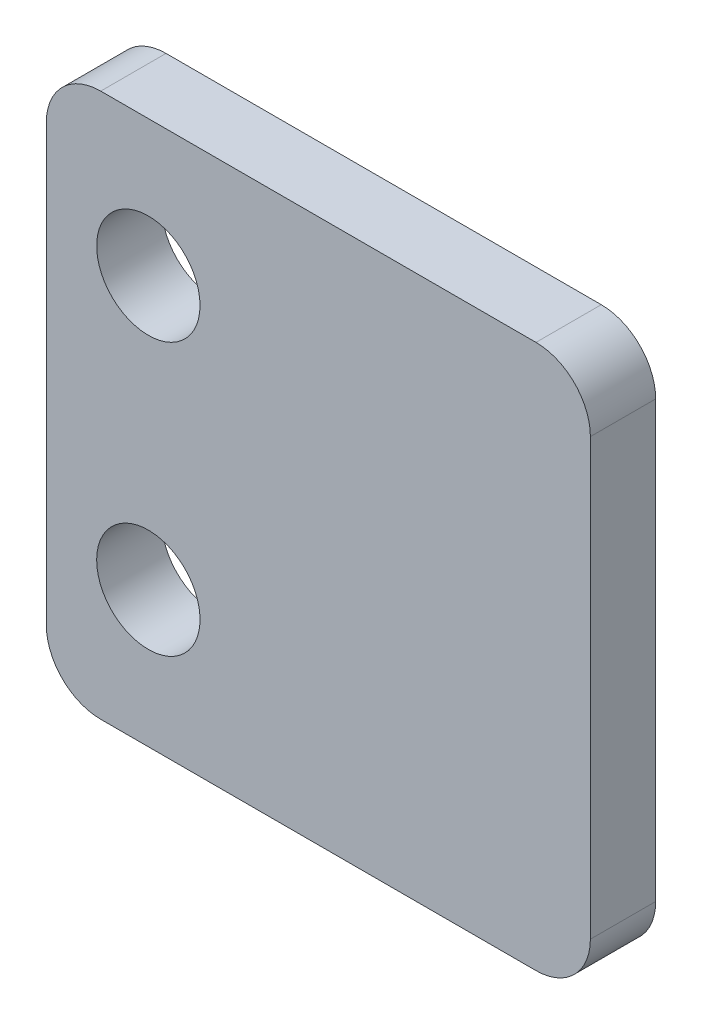
ISO-10303-21;
HEADER;
FILE_DESCRIPTION(('STEP AP214'),'2;1');
FILE_NAME('part.step','',(''),(''),'','','');
FILE_SCHEMA(('AUTOMOTIVE_DESIGN { 1 0 10303 214 1 1 1 1 }'));
ENDSEC;
DATA;
#1=APPLICATION_CONTEXT('core data for automotive mechanical design processes');
#2=APPLICATION_PROTOCOL_DEFINITION('international standard','automotive_design',2000,#1);
#3=PRODUCT_CONTEXT('',#1,'mechanical');
#4=PRODUCT('Part','Part','',(#3));
#5=PRODUCT_RELATED_PRODUCT_CATEGORY('part','',(#4));
#6=PRODUCT_DEFINITION_FORMATION('','',#4);
#7=PRODUCT_DEFINITION_CONTEXT('part definition',#1,'design');
#8=PRODUCT_DEFINITION('design','',#6,#7);
#9=PRODUCT_DEFINITION_SHAPE('','',#8);
#10=(LENGTH_UNIT() NAMED_UNIT(*) SI_UNIT(.MILLI.,.METRE.));
#11=(NAMED_UNIT(*) PLANE_ANGLE_UNIT() SI_UNIT($,.RADIAN.));
#12=(NAMED_UNIT(*) SI_UNIT($,.STERADIAN.) SOLID_ANGLE_UNIT());
#13=UNCERTAINTY_MEASURE_WITH_UNIT(LENGTH_MEASURE(1.E-05),#10,'distance_accuracy_value','');
#14=(GEOMETRIC_REPRESENTATION_CONTEXT(3) GLOBAL_UNCERTAINTY_ASSIGNED_CONTEXT((#13)) GLOBAL_UNIT_ASSIGNED_CONTEXT((#10,
#11,#12)) REPRESENTATION_CONTEXT('',''));
#15=CARTESIAN_POINT('',(0.,0.,0.));
#16=DIRECTION('',(0.,0.,1.));
#17=DIRECTION('',(1.,0.,0.));
#18=AXIS2_PLACEMENT_3D('',#15,#16,#17);
#19=CARTESIAN_POINT('',(-58.42,-12.7,3.048));
#20=DIRECTION('',(0.,1.,0.));
#21=DIRECTION('',(-1.,0.,0.));
#22=AXIS2_PLACEMENT_3D('',#19,#20,#21);
#23=PLANE('',#22);
#24=DIRECTION('',(0.,0.,1.));
#25=VECTOR('',#24,1.);
#26=CARTESIAN_POINT('',(-81.28,-12.7,3.048));
#27=LINE('',#26,#25);
#28=CARTESIAN_POINT('',(-81.28,-12.7,0.));
#29=VERTEX_POINT('',#28);
#30=CARTESIAN_POINT('',(-81.28,-12.7,3.048));
#31=VERTEX_POINT('',#30);
#32=EDGE_CURVE('E11',#29,#31,#27,.T.);
#33=ORIENTED_EDGE('',*,*,#32,.F.);
#34=DIRECTION('',(1.,0.,0.));
#35=VECTOR('',#34,1.);
#36=CARTESIAN_POINT('',(0.,-12.7,0.));
#37=LINE('',#36,#35);
#38=CARTESIAN_POINT('',(-60.96,-12.7,0.));
#39=VERTEX_POINT('',#38);
#40=EDGE_CURVE('E118',#39,#29,#37,.F.);
#41=ORIENTED_EDGE('',*,*,#40,.F.);
#42=DIRECTION('',(0.,0.,1.));
#43=VECTOR('',#42,1.);
#44=CARTESIAN_POINT('',(-60.96,-12.7,3.048));
#45=LINE('',#44,#43);
#46=CARTESIAN_POINT('',(-60.96,-12.7,3.048));
#47=VERTEX_POINT('',#46);
#48=EDGE_CURVE('E58',#39,#47,#45,.T.);
#49=ORIENTED_EDGE('',*,*,#48,.T.);
#50=DIRECTION('',(-1.,0.,0.));
#51=VECTOR('',#50,1.);
#52=CARTESIAN_POINT('',(-58.42,-12.7,3.048));
#53=LINE('',#52,#51);
#54=EDGE_CURVE('E180',#47,#31,#53,.T.);
#55=ORIENTED_EDGE('',*,*,#54,.T.);
#56=EDGE_LOOP('',(#33,#41,#49,#55));
#57=FACE_BOUND('',#56,.T.);
#58=ADVANCED_FACE('F47',(#57),#23,.F.);
#59=CARTESIAN_POINT('',(-60.96,-10.16,3.048));
#60=DIRECTION('',(0.,0.,1.));
#61=DIRECTION('',(1.,0.,0.));
#62=AXIS2_PLACEMENT_3D('',#59,#60,#61);
#63=CYLINDRICAL_SURFACE('',#62,2.54);
#64=ORIENTED_EDGE('',*,*,#48,.F.);
#65=CARTESIAN_POINT('',(-60.96,-10.16,0.));
#66=DIRECTION('',(0.,0.,1.));
#67=DIRECTION('',(1.,0.,0.));
#68=AXIS2_PLACEMENT_3D('',#65,#66,#67);
#69=CIRCLE('',#68,2.54);
#70=CARTESIAN_POINT('',(-58.42,-10.16,0.));
#71=VERTEX_POINT('',#70);
#72=EDGE_CURVE('E147',#39,#71,#69,.T.);
#73=ORIENTED_EDGE('',*,*,#72,.T.);
#74=DIRECTION('',(0.,0.,1.));
#75=VECTOR('',#74,1.);
#76=CARTESIAN_POINT('',(-58.42,-10.16,3.048));
#77=LINE('',#76,#75);
#78=CARTESIAN_POINT('',(-58.42,-10.16,3.048));
#79=VERTEX_POINT('',#78);
#80=EDGE_CURVE('E170',#71,#79,#77,.T.);
#81=ORIENTED_EDGE('',*,*,#80,.T.);
#82=CARTESIAN_POINT('',(-60.96,-10.16,3.048));
#83=DIRECTION('',(0.,0.,1.));
#84=DIRECTION('',(1.,0.,0.));
#85=AXIS2_PLACEMENT_3D('',#82,#83,#84);
#86=CIRCLE('',#85,2.54);
#87=EDGE_CURVE('E190',#47,#79,#86,.T.);
#88=ORIENTED_EDGE('',*,*,#87,.F.);
#89=EDGE_LOOP('',(#64,#73,#81,#88));
#90=FACE_BOUND('',#89,.T.);
#91=ADVANCED_FACE('F194',(#90),#63,.T.);
#92=CARTESIAN_POINT('',(-58.42,12.7,3.048));
#93=DIRECTION('',(-1.,0.,0.));
#94=DIRECTION('',(0.,-1.,0.));
#95=AXIS2_PLACEMENT_3D('',#92,#93,#94);
#96=PLANE('',#95);
#97=ORIENTED_EDGE('',*,*,#80,.F.);
#98=DIRECTION('',(0.,1.,0.));
#99=VECTOR('',#98,1.);
#100=CARTESIAN_POINT('',(-58.42,0.,0.));
#101=LINE('',#100,#99);
#102=CARTESIAN_POINT('',(-58.42,10.16,0.));
#103=VERTEX_POINT('',#102);
#104=EDGE_CURVE('E143',#103,#71,#101,.F.);
#105=ORIENTED_EDGE('',*,*,#104,.F.);
#106=DIRECTION('',(0.,0.,1.));
#107=VECTOR('',#106,1.);
#108=CARTESIAN_POINT('',(-58.42,10.16,3.048));
#109=LINE('',#108,#107);
#110=CARTESIAN_POINT('',(-58.42,10.16,3.048));
#111=VERTEX_POINT('',#110);
#112=EDGE_CURVE('E166',#103,#111,#109,.T.);
#113=ORIENTED_EDGE('',*,*,#112,.T.);
#114=DIRECTION('',(0.,-1.,0.));
#115=VECTOR('',#114,1.);
#116=CARTESIAN_POINT('',(-58.42,12.7,3.048));
#117=LINE('',#116,#115);
#118=EDGE_CURVE('E196',#111,#79,#117,.T.);
#119=ORIENTED_EDGE('',*,*,#118,.T.);
#120=EDGE_LOOP('',(#97,#105,#113,#119));
#121=FACE_BOUND('',#120,.T.);
#122=ADVANCED_FACE('F239',(#121),#96,.F.);
#123=CARTESIAN_POINT('',(-60.96,10.16,3.048));
#124=DIRECTION('',(0.,0.,1.));
#125=DIRECTION('',(1.,0.,0.));
#126=AXIS2_PLACEMENT_3D('',#123,#124,#125);
#127=CYLINDRICAL_SURFACE('',#126,2.54);
#128=ORIENTED_EDGE('',*,*,#112,.F.);
#129=CARTESIAN_POINT('',(-60.96,10.16,0.));
#130=DIRECTION('',(0.,0.,1.));
#131=DIRECTION('',(1.,0.,0.));
#132=AXIS2_PLACEMENT_3D('',#129,#130,#131);
#133=CIRCLE('',#132,2.54);
#134=CARTESIAN_POINT('',(-60.96,12.7,0.));
#135=VERTEX_POINT('',#134);
#136=EDGE_CURVE('E139',#103,#135,#133,.T.);
#137=ORIENTED_EDGE('',*,*,#136,.T.);
#138=DIRECTION('',(0.,0.,1.));
#139=VECTOR('',#138,1.);
#140=CARTESIAN_POINT('',(-60.96,12.7,3.048));
#141=LINE('',#140,#139);
#142=CARTESIAN_POINT('',(-60.96,12.7,3.048));
#143=VERTEX_POINT('',#142);
#144=EDGE_CURVE('E162',#135,#143,#141,.T.);
#145=ORIENTED_EDGE('',*,*,#144,.T.);
#146=CARTESIAN_POINT('',(-60.96,10.16,3.048));
#147=DIRECTION('',(0.,0.,1.));
#148=DIRECTION('',(1.,0.,0.));
#149=AXIS2_PLACEMENT_3D('',#146,#147,#148);
#150=CIRCLE('',#149,2.54);
#151=EDGE_CURVE('E200',#111,#143,#150,.T.);
#152=ORIENTED_EDGE('',*,*,#151,.F.);
#153=EDGE_LOOP('',(#128,#137,#145,#152));
#154=FACE_BOUND('',#153,.T.);
#155=ADVANCED_FACE('F262',(#154),#127,.T.);
#156=CARTESIAN_POINT('',(-58.42,12.7,3.048));
#157=DIRECTION('',(0.,1.,0.));
#158=DIRECTION('',(-1.,0.,0.));
#159=AXIS2_PLACEMENT_3D('',#156,#157,#158);
#160=PLANE('',#159);
#161=ORIENTED_EDGE('',*,*,#144,.F.);
#162=DIRECTION('',(1.,0.,0.));
#163=VECTOR('',#162,1.);
#164=CARTESIAN_POINT('',(0.,12.7,0.));
#165=LINE('',#164,#163);
#166=CARTESIAN_POINT('',(-81.28,12.7,0.));
#167=VERTEX_POINT('',#166);
#168=EDGE_CURVE('E135',#135,#167,#165,.F.);
#169=ORIENTED_EDGE('',*,*,#168,.T.);
#170=DIRECTION('',(0.,0.,1.));
#171=VECTOR('',#170,1.);
#172=CARTESIAN_POINT('',(-81.28,12.7,3.048));
#173=LINE('',#172,#171);
#174=CARTESIAN_POINT('',(-81.28,12.7,3.048));
#175=VERTEX_POINT('',#174);
#176=EDGE_CURVE('E159',#167,#175,#173,.T.);
#177=ORIENTED_EDGE('',*,*,#176,.T.);
#178=DIRECTION('',(-1.,0.,0.));
#179=VECTOR('',#178,1.);
#180=CARTESIAN_POINT('',(-58.42,12.7,3.048));
#181=LINE('',#180,#179);
#182=EDGE_CURVE('E207',#143,#175,#181,.T.);
#183=ORIENTED_EDGE('',*,*,#182,.F.);
#184=EDGE_LOOP('',(#161,#169,#177,#183));
#185=FACE_BOUND('',#184,.T.);
#186=ADVANCED_FACE('F259',(#185),#160,.T.);
#187=CARTESIAN_POINT('',(-81.28,10.16,3.048));
#188=DIRECTION('',(0.,0.,1.));
#189=DIRECTION('',(1.,0.,0.));
#190=AXIS2_PLACEMENT_3D('',#187,#188,#189);
#191=CYLINDRICAL_SURFACE('',#190,2.54);
#192=ORIENTED_EDGE('',*,*,#176,.F.);
#193=CARTESIAN_POINT('',(-81.28,10.16,0.));
#194=DIRECTION('',(0.,0.,1.));
#195=DIRECTION('',(1.,0.,0.));
#196=AXIS2_PLACEMENT_3D('',#193,#194,#195);
#197=CIRCLE('',#196,2.54);
#198=CARTESIAN_POINT('',(-83.82,10.16,0.));
#199=VERTEX_POINT('',#198);
#200=EDGE_CURVE('E131',#167,#199,#197,.T.);
#201=ORIENTED_EDGE('',*,*,#200,.T.);
#202=DIRECTION('',(0.,0.,1.));
#203=VECTOR('',#202,1.);
#204=CARTESIAN_POINT('',(-83.82,10.16,3.048));
#205=LINE('',#204,#203);
#206=CARTESIAN_POINT('',(-83.82,10.16,3.048));
#207=VERTEX_POINT('',#206);
#208=EDGE_CURVE('E66',#199,#207,#205,.T.);
#209=ORIENTED_EDGE('',*,*,#208,.T.);
#210=CARTESIAN_POINT('',(-81.28,10.16,3.048));
#211=DIRECTION('',(0.,0.,1.));
#212=DIRECTION('',(1.,0.,0.));
#213=AXIS2_PLACEMENT_3D('',#210,#211,#212);
#214=CIRCLE('',#213,2.54);
#215=EDGE_CURVE('E211',#175,#207,#214,.T.);
#216=ORIENTED_EDGE('',*,*,#215,.F.);
#217=EDGE_LOOP('',(#192,#201,#209,#216));
#218=FACE_BOUND('',#217,.T.);
#219=ADVANCED_FACE('F252',(#218),#191,.T.);
#220=CARTESIAN_POINT('',(-83.82,12.7,3.048));
#221=DIRECTION('',(-1.,0.,0.));
#222=DIRECTION('',(0.,-1.,0.));
#223=AXIS2_PLACEMENT_3D('',#220,#221,#222);
#224=PLANE('',#223);
#225=ORIENTED_EDGE('',*,*,#208,.F.);
#226=DIRECTION('',(0.,1.,0.));
#227=VECTOR('',#226,1.);
#228=CARTESIAN_POINT('',(-83.82,0.,0.));
#229=LINE('',#228,#227);
#230=CARTESIAN_POINT('',(-83.82,-10.16,0.));
#231=VERTEX_POINT('',#230);
#232=EDGE_CURVE('E116',#199,#231,#229,.F.);
#233=ORIENTED_EDGE('',*,*,#232,.T.);
#234=DIRECTION('',(0.,0.,1.));
#235=VECTOR('',#234,1.);
#236=CARTESIAN_POINT('',(-83.82,-10.16,3.048));
#237=LINE('',#236,#235);
#238=CARTESIAN_POINT('',(-83.82,-10.16,3.048));
#239=VERTEX_POINT('',#238);
#240=EDGE_CURVE('E51',#231,#239,#237,.T.);
#241=ORIENTED_EDGE('',*,*,#240,.T.);
#242=DIRECTION('',(0.,-1.,0.));
#243=VECTOR('',#242,1.);
#244=CARTESIAN_POINT('',(-83.82,12.7,3.048));
#245=LINE('',#244,#243);
#246=EDGE_CURVE('E277',#207,#239,#245,.T.);
#247=ORIENTED_EDGE('',*,*,#246,.F.);
#248=EDGE_LOOP('',(#225,#233,#241,#247));
#249=FACE_BOUND('',#248,.T.);
#250=ADVANCED_FACE('F121',(#249),#224,.T.);
#251=CARTESIAN_POINT('',(-79.0575,-6.35,3.048));
#252=DIRECTION('',(0.,0.,1.));
#253=DIRECTION('',(1.,0.,0.));
#254=AXIS2_PLACEMENT_3D('',#251,#252,#253);
#255=CYLINDRICAL_SURFACE('',#254,2.413);
#256=CARTESIAN_POINT('',(-79.0575,-6.35,3.048));
#257=DIRECTION('',(0.,0.,-1.));
#258=DIRECTION('',(-1.,0.,0.));
#259=AXIS2_PLACEMENT_3D('',#256,#257,#258);
#260=CIRCLE('',#259,2.413);
#261=CARTESIAN_POINT('',(-81.4705,-6.35,3.048));
#262=VERTEX_POINT('',#261);
#263=EDGE_CURVE('E156',#262,#262,#260,.T.);
#264=ORIENTED_EDGE('',*,*,#263,.F.);
#265=EDGE_LOOP('',(#264));
#266=FACE_BOUND('',#265,.T.);
#267=CARTESIAN_POINT('',(-79.0575,-6.35,0.));
#268=DIRECTION('',(0.,0.,-1.));
#269=DIRECTION('',(-1.,0.,0.));
#270=AXIS2_PLACEMENT_3D('',#267,#268,#269);
#271=CIRCLE('',#270,2.413);
#272=CARTESIAN_POINT('',(-81.4705,-6.35,0.));
#273=VERTEX_POINT('',#272);
#274=EDGE_CURVE('E123',#273,#273,#271,.T.);
#275=ORIENTED_EDGE('',*,*,#274,.T.);
#276=EDGE_LOOP('',(#275));
#277=FACE_BOUND('',#276,.T.);
#278=ADVANCED_FACE('F243',(#266,#277),#255,.F.);
#279=CARTESIAN_POINT('',(-81.28,-10.16,3.048));
#280=DIRECTION('',(0.,0.,1.));
#281=DIRECTION('',(1.,0.,0.));
#282=AXIS2_PLACEMENT_3D('',#279,#280,#281);
#283=CYLINDRICAL_SURFACE('',#282,2.54);
#284=CARTESIAN_POINT('',(-81.28,-10.16,0.));
#285=DIRECTION('',(0.,0.,1.));
#286=DIRECTION('',(1.,0.,0.));
#287=AXIS2_PLACEMENT_3D('',#284,#285,#286);
#288=CIRCLE('',#287,2.54);
#289=EDGE_CURVE('E103',#231,#29,#288,.T.);
#290=ORIENTED_EDGE('',*,*,#289,.T.);
#291=ORIENTED_EDGE('',*,*,#32,.T.);
#292=CARTESIAN_POINT('',(-81.28,-10.16,3.048));
#293=DIRECTION('',(0.,0.,1.));
#294=DIRECTION('',(1.,0.,0.));
#295=AXIS2_PLACEMENT_3D('',#292,#293,#294);
#296=CIRCLE('',#295,2.54);
#297=EDGE_CURVE('E105',#239,#31,#296,.T.);
#298=ORIENTED_EDGE('',*,*,#297,.F.);
#299=ORIENTED_EDGE('',*,*,#240,.F.);
#300=EDGE_LOOP('',(#290,#291,#298,#299));
#301=FACE_BOUND('',#300,.T.);
#302=ADVANCED_FACE('F102',(#301),#283,.T.);
#303=CARTESIAN_POINT('',(-79.0575,6.35,3.048));
#304=DIRECTION('',(0.,0.,1.));
#305=DIRECTION('',(1.,0.,0.));
#306=AXIS2_PLACEMENT_3D('',#303,#304,#305);
#307=CYLINDRICAL_SURFACE('',#306,2.413);
#308=CARTESIAN_POINT('',(-79.0575,6.35,3.048));
#309=DIRECTION('',(0.,0.,1.));
#310=DIRECTION('',(1.,0.,0.));
#311=AXIS2_PLACEMENT_3D('',#308,#309,#310);
#312=CIRCLE('',#311,2.413);
#313=CARTESIAN_POINT('',(-76.6445,6.35,3.048));
#314=VERTEX_POINT('',#313);
#315=EDGE_CURVE('E110',#314,#314,#312,.T.);
#316=ORIENTED_EDGE('',*,*,#315,.T.);
#317=EDGE_LOOP('',(#316));
#318=FACE_BOUND('',#317,.T.);
#319=CARTESIAN_POINT('',(-79.0575,6.35,0.));
#320=DIRECTION('',(0.,0.,1.));
#321=DIRECTION('',(1.,0.,0.));
#322=AXIS2_PLACEMENT_3D('',#319,#320,#321);
#323=CIRCLE('',#322,2.413);
#324=CARTESIAN_POINT('',(-76.6445,6.35,0.));
#325=VERTEX_POINT('',#324);
#326=EDGE_CURVE('E134',#325,#325,#323,.T.);
#327=ORIENTED_EDGE('',*,*,#326,.F.);
#328=EDGE_LOOP('',(#327));
#329=FACE_BOUND('',#328,.T.);
#330=ADVANCED_FACE('F49',(#318,#329),#307,.F.);
#331=CARTESIAN_POINT('',(0.,0.,3.048));
#332=DIRECTION('',(0.,0.,1.));
#333=DIRECTION('',(1.,0.,0.));
#334=AXIS2_PLACEMENT_3D('',#331,#332,#333);
#335=PLANE('',#334);
#336=ORIENTED_EDGE('',*,*,#263,.T.);
#337=EDGE_LOOP('',(#336));
#338=FACE_BOUND('',#337,.T.);
#339=ORIENTED_EDGE('',*,*,#246,.T.);
#340=ORIENTED_EDGE('',*,*,#297,.T.);
#341=ORIENTED_EDGE('',*,*,#54,.F.);
#342=ORIENTED_EDGE('',*,*,#87,.T.);
#343=ORIENTED_EDGE('',*,*,#118,.F.);
#344=ORIENTED_EDGE('',*,*,#151,.T.);
#345=ORIENTED_EDGE('',*,*,#182,.T.);
#346=ORIENTED_EDGE('',*,*,#215,.T.);
#347=EDGE_LOOP('',(#339,#340,#341,#342,#343,#344,#345,#346));
#348=FACE_BOUND('',#347,.T.);
#349=ORIENTED_EDGE('',*,*,#315,.F.);
#350=EDGE_LOOP('',(#349));
#351=FACE_BOUND('',#350,.T.);
#352=ADVANCED_FACE('F187',(#338,#348,#351),#335,.T.);
#353=CARTESIAN_POINT('',(0.,0.,0.));
#354=DIRECTION('',(0.,0.,1.));
#355=DIRECTION('',(1.,0.,0.));
#356=AXIS2_PLACEMENT_3D('',#353,#354,#355);
#357=PLANE('',#356);
#358=ORIENTED_EDGE('',*,*,#274,.F.);
#359=EDGE_LOOP('',(#358));
#360=FACE_BOUND('',#359,.T.);
#361=ORIENTED_EDGE('',*,*,#232,.F.);
#362=ORIENTED_EDGE('',*,*,#200,.F.);
#363=ORIENTED_EDGE('',*,*,#168,.F.);
#364=ORIENTED_EDGE('',*,*,#136,.F.);
#365=ORIENTED_EDGE('',*,*,#104,.T.);
#366=ORIENTED_EDGE('',*,*,#72,.F.);
#367=ORIENTED_EDGE('',*,*,#40,.T.);
#368=ORIENTED_EDGE('',*,*,#289,.F.);
#369=EDGE_LOOP('',(#361,#362,#363,#364,#365,#366,#367,#368));
#370=FACE_BOUND('',#369,.T.);
#371=ORIENTED_EDGE('',*,*,#326,.T.);
#372=EDGE_LOOP('',(#371));
#373=FACE_BOUND('',#372,.T.);
#374=ADVANCED_FACE('F113',(#360,#370,#373),#357,.F.);
#375=CLOSED_SHELL('',(#58,#91,#122,#155,#186,#219,#250,#278,#302,#330,#352,#374));
#376=MANIFOLD_SOLID_BREP('B2',#375);
#377=ADVANCED_BREP_SHAPE_REPRESENTATION('',(#18,#376),#14);
#378=SHAPE_DEFINITION_REPRESENTATION(#9,#377);
ENDSEC;
END-ISO-10303-21;
